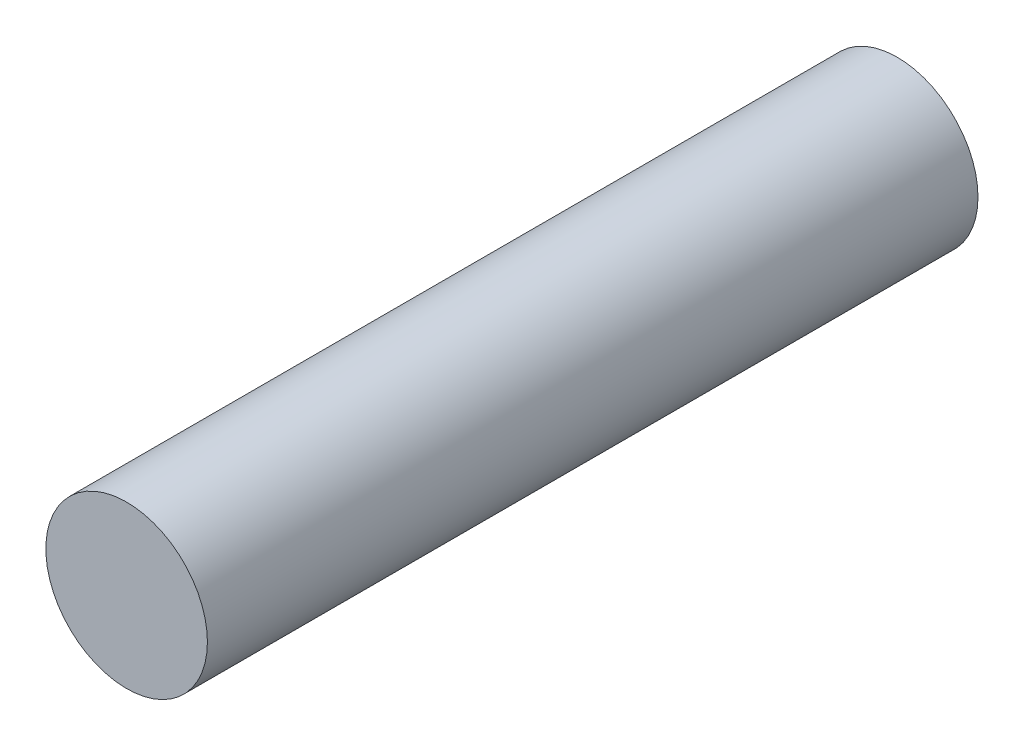
ISO-10303-21;
HEADER;
FILE_DESCRIPTION(('STEP AP214'),'2;1');
FILE_NAME('part.step','',(''),(''),'','','');
FILE_SCHEMA(('AUTOMOTIVE_DESIGN { 1 0 10303 214 1 1 1 1 }'));
ENDSEC;
DATA;
#1=APPLICATION_CONTEXT('core data for automotive mechanical design processes');
#2=APPLICATION_PROTOCOL_DEFINITION('international standard','automotive_design',2000,#1);
#3=PRODUCT_CONTEXT('',#1,'mechanical');
#4=PRODUCT('Part','Part','',(#3));
#5=PRODUCT_RELATED_PRODUCT_CATEGORY('part','',(#4));
#6=PRODUCT_DEFINITION_FORMATION('','',#4);
#7=PRODUCT_DEFINITION_CONTEXT('part definition',#1,'design');
#8=PRODUCT_DEFINITION('design','',#6,#7);
#9=PRODUCT_DEFINITION_SHAPE('','',#8);
#10=(LENGTH_UNIT() NAMED_UNIT(*) SI_UNIT(.MILLI.,.METRE.));
#11=(NAMED_UNIT(*) PLANE_ANGLE_UNIT() SI_UNIT($,.RADIAN.));
#12=(NAMED_UNIT(*) SI_UNIT($,.STERADIAN.) SOLID_ANGLE_UNIT());
#13=UNCERTAINTY_MEASURE_WITH_UNIT(LENGTH_MEASURE(1.E-05),#10,'distance_accuracy_value','');
#14=(GEOMETRIC_REPRESENTATION_CONTEXT(3) GLOBAL_UNCERTAINTY_ASSIGNED_CONTEXT((#13)) GLOBAL_UNIT_ASSIGNED_CONTEXT((#10,
#11,#12)) REPRESENTATION_CONTEXT('',''));
#15=CARTESIAN_POINT('',(0.,0.,0.));
#16=DIRECTION('',(0.,0.,1.));
#17=DIRECTION('',(1.,0.,0.));
#18=AXIS2_PLACEMENT_3D('',#15,#16,#17);
#19=CARTESIAN_POINT('',(0.,0.,31.));
#20=DIRECTION('',(0.,0.,-1.));
#21=DIRECTION('',(-1.,0.,0.));
#22=AXIS2_PLACEMENT_3D('',#19,#20,#21);
#23=CYLINDRICAL_SURFACE('',#22,3.25);
#24=CARTESIAN_POINT('',(0.,0.,31.));
#25=DIRECTION('',(0.,0.,1.));
#26=DIRECTION('',(1.,0.,0.));
#27=AXIS2_PLACEMENT_3D('',#24,#25,#26);
#28=CIRCLE('',#27,3.25);
#29=CARTESIAN_POINT('',(3.25,0.,31.));
#30=VERTEX_POINT('',#29);
#31=EDGE_CURVE('E10',#30,#30,#28,.T.);
#32=ORIENTED_EDGE('',*,*,#31,.F.);
#33=EDGE_LOOP('',(#32));
#34=FACE_BOUND('',#33,.T.);
#35=CARTESIAN_POINT('',(0.,0.,0.));
#36=DIRECTION('',(0.,0.,1.));
#37=DIRECTION('',(1.,0.,0.));
#38=AXIS2_PLACEMENT_3D('',#35,#36,#37);
#39=CIRCLE('',#38,3.25);
#40=CARTESIAN_POINT('',(3.25,0.,0.));
#41=VERTEX_POINT('',#40);
#42=EDGE_CURVE('E34',#41,#41,#39,.T.);
#43=ORIENTED_EDGE('',*,*,#42,.T.);
#44=EDGE_LOOP('',(#43));
#45=FACE_BOUND('',#44,.T.);
#46=ADVANCED_FACE('F31',(#34,#45),#23,.T.);
#47=CARTESIAN_POINT('',(0.,0.,31.));
#48=DIRECTION('',(0.,0.,1.));
#49=DIRECTION('',(1.,0.,0.));
#50=AXIS2_PLACEMENT_3D('',#47,#48,#49);
#51=PLANE('',#50);
#52=ORIENTED_EDGE('',*,*,#31,.T.);
#53=EDGE_LOOP('',(#52));
#54=FACE_BOUND('',#53,.T.);
#55=ADVANCED_FACE('F46',(#54),#51,.T.);
#56=CARTESIAN_POINT('',(0.,0.,0.));
#57=DIRECTION('',(0.,0.,1.));
#58=DIRECTION('',(1.,0.,0.));
#59=AXIS2_PLACEMENT_3D('',#56,#57,#58);
#60=PLANE('',#59);
#61=ORIENTED_EDGE('',*,*,#42,.F.);
#62=EDGE_LOOP('',(#61));
#63=FACE_BOUND('',#62,.T.);
#64=ADVANCED_FACE('F44',(#63),#60,.F.);
#65=CLOSED_SHELL('',(#46,#55,#64));
#66=MANIFOLD_SOLID_BREP('B2',#65);
#67=ADVANCED_BREP_SHAPE_REPRESENTATION('',(#18,#66),#14);
#68=SHAPE_DEFINITION_REPRESENTATION(#9,#67);
ENDSEC;
END-ISO-10303-21;
